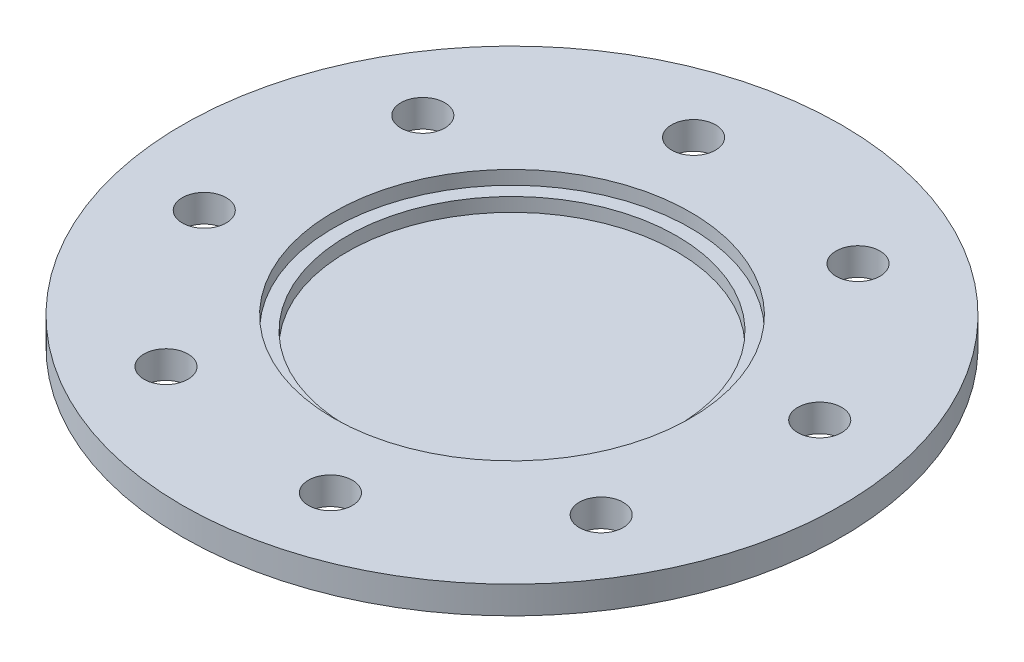
ISO-10303-21;
HEADER;
FILE_DESCRIPTION(('STEP AP214'),'2;1');
FILE_NAME('part.step','',(''),(''),'','','');
FILE_SCHEMA(('AUTOMOTIVE_DESIGN { 1 0 10303 214 1 1 1 1 }'));
ENDSEC;
DATA;
#1=APPLICATION_CONTEXT('core data for automotive mechanical design processes');
#2=APPLICATION_PROTOCOL_DEFINITION('international standard','automotive_design',2000,#1);
#3=PRODUCT_CONTEXT('',#1,'mechanical');
#4=PRODUCT('Part','Part','',(#3));
#5=PRODUCT_RELATED_PRODUCT_CATEGORY('part','',(#4));
#6=PRODUCT_DEFINITION_FORMATION('','',#4);
#7=PRODUCT_DEFINITION_CONTEXT('part definition',#1,'design');
#8=PRODUCT_DEFINITION('design','',#6,#7);
#9=PRODUCT_DEFINITION_SHAPE('','',#8);
#10=(LENGTH_UNIT() NAMED_UNIT(*) SI_UNIT(.MILLI.,.METRE.));
#11=(NAMED_UNIT(*) PLANE_ANGLE_UNIT() SI_UNIT($,.RADIAN.));
#12=(NAMED_UNIT(*) SI_UNIT($,.STERADIAN.) SOLID_ANGLE_UNIT());
#13=UNCERTAINTY_MEASURE_WITH_UNIT(LENGTH_MEASURE(1.E-05),#10,'distance_accuracy_value','');
#14=(GEOMETRIC_REPRESENTATION_CONTEXT(3) GLOBAL_UNCERTAINTY_ASSIGNED_CONTEXT((#13)) GLOBAL_UNIT_ASSIGNED_CONTEXT((#10,
#11,#12)) REPRESENTATION_CONTEXT('',''));
#15=CARTESIAN_POINT('',(0.,0.,0.));
#16=DIRECTION('',(0.,0.,1.));
#17=DIRECTION('',(1.,0.,0.));
#18=AXIS2_PLACEMENT_3D('',#15,#16,#17);
#19=CARTESIAN_POINT('',(0.,26.2861715894821,0.));
#20=DIRECTION('',(0.,1.,0.));
#21=DIRECTION('',(0.,0.,1.));
#22=AXIS2_PLACEMENT_3D('',#19,#20,#21);
#23=TOROIDAL_SURFACE('',#22,75.,5.);
#24=CARTESIAN_POINT('',(0.,26.2861715894821,0.));
#25=DIRECTION('',(0.,1.,0.));
#26=DIRECTION('',(0.,0.,1.));
#27=AXIS2_PLACEMENT_3D('',#24,#25,#26);
#28=CIRCLE('',#27,70.);
#29=CARTESIAN_POINT('',(0.,26.2861715894821,70.));
#30=VERTEX_POINT('',#29);
#31=EDGE_CURVE('E76',#30,#30,#28,.T.);
#32=ORIENTED_EDGE('',*,*,#31,.T.);
#33=EDGE_LOOP('',(#32));
#34=FACE_BOUND('',#33,.T.);
#35=CARTESIAN_POINT('',(0.,31.2861715894821,0.));
#36=DIRECTION('',(0.,1.,0.));
#37=DIRECTION('',(0.,0.,1.));
#38=AXIS2_PLACEMENT_3D('',#35,#36,#37);
#39=CIRCLE('',#38,75.);
#40=CARTESIAN_POINT('',(0.,31.2861715894821,75.));
#41=VERTEX_POINT('',#40);
#42=EDGE_CURVE('E10',#41,#41,#39,.T.);
#43=ORIENTED_EDGE('',*,*,#42,.F.);
#44=EDGE_LOOP('',(#43));
#45=FACE_BOUND('',#44,.T.);
#46=ADVANCED_FACE('F37',(#34,#45),#23,.F.);
#47=CARTESIAN_POINT('',(0.,31.2861715894821,0.));
#48=DIRECTION('',(0.,-1.,0.));
#49=DIRECTION('',(0.,0.,-1.));
#50=AXIS2_PLACEMENT_3D('',#47,#48,#49);
#51=PLANE('',#50);
#52=CARTESIAN_POINT('',(89.0872571350659,31.2861715894821,-22.9665107526295));
#53=DIRECTION('',(0.,-1.,0.));
#54=DIRECTION('',(-0.707106781186539,0.,-0.707106781186556));
#55=AXIS2_PLACEMENT_3D('',#52,#53,#54);
#56=CIRCLE('',#55,8.);
#57=CARTESIAN_POINT('',(83.4304028855736,31.2861715894821,-28.623365002122));
#58=VERTEX_POINT('',#57);
#59=EDGE_CURVE('E97',#58,#58,#56,.T.);
#60=ORIENTED_EDGE('',*,*,#59,.F.);
#61=EDGE_LOOP('',(#60));
#62=FACE_BOUND('',#61,.T.);
#63=CARTESIAN_POINT('',(46.7544281441365,31.2861715894821,-79.2339791308929));
#64=DIRECTION('',(0.,-1.,0.));
#65=DIRECTION('',(-1.,0.,0.));
#66=AXIS2_PLACEMENT_3D('',#63,#64,#65);
#67=CIRCLE('',#66,8.);
#68=CARTESIAN_POINT('',(38.7544281441365,31.2861715894821,-79.233979130893));
#69=VERTEX_POINT('',#68);
#70=EDGE_CURVE('E105',#69,#69,#67,.T.);
#71=ORIENTED_EDGE('',*,*,#70,.F.);
#72=EDGE_LOOP('',(#71));
#73=FACE_BOUND('',#72,.T.);
#74=CARTESIAN_POINT('',(-22.9665107526298,31.2861715894821,-89.0872571350658));
#75=DIRECTION('',(0.,-1.,0.));
#76=DIRECTION('',(-0.707106781186554,0.,0.707106781186541));
#77=AXIS2_PLACEMENT_3D('',#74,#75,#76);
#78=CIRCLE('',#77,8.);
#79=CARTESIAN_POINT('',(-28.6233650021223,31.2861715894821,-83.4304028855735));
#80=VERTEX_POINT('',#79);
#81=EDGE_CURVE('E113',#80,#80,#78,.T.);
#82=ORIENTED_EDGE('',*,*,#81,.F.);
#83=EDGE_LOOP('',(#82));
#84=FACE_BOUND('',#83,.T.);
#85=CARTESIAN_POINT('',(-79.2339791308934,31.2861715894821,-46.7544281441357));
#86=DIRECTION('',(0.,-1.,0.));
#87=DIRECTION('',(0.,0.,1.));
#88=AXIS2_PLACEMENT_3D('',#85,#86,#87);
#89=CIRCLE('',#88,8.);
#90=CARTESIAN_POINT('',(-79.2339791308934,31.2861715894821,-38.7544281441357));
#91=VERTEX_POINT('',#90);
#92=EDGE_CURVE('E121',#91,#91,#89,.T.);
#93=ORIENTED_EDGE('',*,*,#92,.F.);
#94=EDGE_LOOP('',(#93));
#95=FACE_BOUND('',#94,.T.);
#96=CARTESIAN_POINT('',(-89.0872571350657,31.2861715894821,22.9665107526301));
#97=DIRECTION('',(0.,-1.,0.));
#98=DIRECTION('',(0.707106781186544,0.,0.707106781186551));
#99=AXIS2_PLACEMENT_3D('',#96,#97,#98);
#100=CIRCLE('',#99,8.);
#101=CARTESIAN_POINT('',(-83.4304028855734,31.2861715894821,28.6233650021226));
#102=VERTEX_POINT('',#101);
#103=EDGE_CURVE('E129',#102,#102,#100,.T.);
#104=ORIENTED_EDGE('',*,*,#103,.F.);
#105=EDGE_LOOP('',(#104));
#106=FACE_BOUND('',#105,.T.);
#107=CARTESIAN_POINT('',(-46.754428144136,31.2861715894821,79.2339791308932));
#108=DIRECTION('',(0.,-1.,0.));
#109=DIRECTION('',(1.,0.,0.));
#110=AXIS2_PLACEMENT_3D('',#107,#108,#109);
#111=CIRCLE('',#110,8.);
#112=CARTESIAN_POINT('',(-38.754428144136,31.2861715894821,79.2339791308933));
#113=VERTEX_POINT('',#112);
#114=EDGE_CURVE('E137',#113,#113,#111,.T.);
#115=ORIENTED_EDGE('',*,*,#114,.F.);
#116=EDGE_LOOP('',(#115));
#117=FACE_BOUND('',#116,.T.);
#118=CARTESIAN_POINT('',(22.9665107526305,31.2861715894821,89.0872571350657));
#119=DIRECTION('',(0.,-1.,0.));
#120=DIRECTION('',(0.707106781186549,0.,-0.707106781186546));
#121=AXIS2_PLACEMENT_3D('',#118,#119,#120);
#122=CIRCLE('',#121,8.);
#123=CARTESIAN_POINT('',(28.6233650021229,31.2861715894821,83.4304028855733));
#124=VERTEX_POINT('',#123);
#125=EDGE_CURVE('E89',#124,#124,#122,.T.);
#126=ORIENTED_EDGE('',*,*,#125,.F.);
#127=EDGE_LOOP('',(#126));
#128=FACE_BOUND('',#127,.T.);
#129=CARTESIAN_POINT('',(79.2339791308934,31.2861715894821,46.7544281441357));
#130=DIRECTION('',(0.,-1.,0.));
#131=DIRECTION('',(0.,0.,-1.));
#132=AXIS2_PLACEMENT_3D('',#129,#130,#131);
#133=CIRCLE('',#132,8.);
#134=CARTESIAN_POINT('',(79.2339791308934,31.2861715894821,38.7544281441357));
#135=VERTEX_POINT('',#134);
#136=EDGE_CURVE('E81',#135,#135,#133,.T.);
#137=ORIENTED_EDGE('',*,*,#136,.F.);
#138=EDGE_LOOP('',(#137));
#139=FACE_BOUND('',#138,.T.);
#140=ORIENTED_EDGE('',*,*,#42,.T.);
#141=EDGE_LOOP('',(#140));
#142=FACE_BOUND('',#141,.T.);
#143=CARTESIAN_POINT('',(0.,31.2861715894821,0.));
#144=DIRECTION('',(0.,1.,0.));
#145=DIRECTION('',(0.,0.,1.));
#146=AXIS2_PLACEMENT_3D('',#143,#144,#145);
#147=CIRCLE('',#146,120.);
#148=CARTESIAN_POINT('',(0.,31.2861715894821,120.));
#149=VERTEX_POINT('',#148);
#150=EDGE_CURVE('E44',#149,#149,#147,.T.);
#151=ORIENTED_EDGE('',*,*,#150,.F.);
#152=EDGE_LOOP('',(#151));
#153=FACE_BOUND('',#152,.T.);
#154=ADVANCED_FACE('F156',(#62,#73,#84,#95,#106,#117,#128,#139,#142,#153),#51,.T.);
#155=CARTESIAN_POINT('',(0.,97.7316257619381,0.));
#156=DIRECTION('',(0.,1.,0.));
#157=DIRECTION('',(0.,0.,1.));
#158=AXIS2_PLACEMENT_3D('',#155,#156,#157);
#159=CYLINDRICAL_SURFACE('',#158,120.);
#160=ORIENTED_EDGE('',*,*,#150,.T.);
#161=EDGE_LOOP('',(#160));
#162=FACE_BOUND('',#161,.T.);
#163=CARTESIAN_POINT('',(0.,41.2861715894822,0.));
#164=DIRECTION('',(0.,1.,0.));
#165=DIRECTION('',(0.,0.,1.));
#166=AXIS2_PLACEMENT_3D('',#163,#164,#165);
#167=CIRCLE('',#166,120.);
#168=CARTESIAN_POINT('',(0.,41.2861715894822,120.));
#169=VERTEX_POINT('',#168);
#170=EDGE_CURVE('E49',#169,#169,#167,.T.);
#171=ORIENTED_EDGE('',*,*,#170,.F.);
#172=EDGE_LOOP('',(#171));
#173=FACE_BOUND('',#172,.T.);
#174=ADVANCED_FACE('F159',(#162,#173),#159,.T.);
#175=CARTESIAN_POINT('',(0.,41.2861715894822,0.));
#176=DIRECTION('',(0.,1.,0.));
#177=DIRECTION('',(0.,0.,1.));
#178=AXIS2_PLACEMENT_3D('',#175,#176,#177);
#179=PLANE('',#178);
#180=CARTESIAN_POINT('',(89.0872571350659,41.2861715894822,-22.9665107526295));
#181=DIRECTION('',(0.,-1.,0.));
#182=DIRECTION('',(-0.707106781186539,0.,-0.707106781186556));
#183=AXIS2_PLACEMENT_3D('',#180,#181,#182);
#184=CIRCLE('',#183,8.);
#185=CARTESIAN_POINT('',(83.4304028855736,41.2861715894822,-28.623365002122));
#186=VERTEX_POINT('',#185);
#187=EDGE_CURVE('E101',#186,#186,#184,.T.);
#188=ORIENTED_EDGE('',*,*,#187,.T.);
#189=EDGE_LOOP('',(#188));
#190=FACE_BOUND('',#189,.T.);
#191=CARTESIAN_POINT('',(46.7544281441365,41.2861715894822,-79.2339791308929));
#192=DIRECTION('',(0.,-1.,0.));
#193=DIRECTION('',(-1.,0.,0.));
#194=AXIS2_PLACEMENT_3D('',#191,#192,#193);
#195=CIRCLE('',#194,8.);
#196=CARTESIAN_POINT('',(38.7544281441365,41.2861715894822,-79.233979130893));
#197=VERTEX_POINT('',#196);
#198=EDGE_CURVE('E109',#197,#197,#195,.T.);
#199=ORIENTED_EDGE('',*,*,#198,.T.);
#200=EDGE_LOOP('',(#199));
#201=FACE_BOUND('',#200,.T.);
#202=CARTESIAN_POINT('',(-22.9665107526298,41.2861715894822,-89.0872571350658));
#203=DIRECTION('',(0.,-1.,0.));
#204=DIRECTION('',(-0.707106781186554,0.,0.707106781186541));
#205=AXIS2_PLACEMENT_3D('',#202,#203,#204);
#206=CIRCLE('',#205,8.);
#207=CARTESIAN_POINT('',(-28.6233650021223,41.2861715894822,-83.4304028855735));
#208=VERTEX_POINT('',#207);
#209=EDGE_CURVE('E117',#208,#208,#206,.T.);
#210=ORIENTED_EDGE('',*,*,#209,.T.);
#211=EDGE_LOOP('',(#210));
#212=FACE_BOUND('',#211,.T.);
#213=CARTESIAN_POINT('',(-79.2339791308934,41.2861715894822,-46.7544281441357));
#214=DIRECTION('',(0.,-1.,0.));
#215=DIRECTION('',(0.,0.,1.));
#216=AXIS2_PLACEMENT_3D('',#213,#214,#215);
#217=CIRCLE('',#216,8.);
#218=CARTESIAN_POINT('',(-79.2339791308934,41.2861715894822,-38.7544281441357));
#219=VERTEX_POINT('',#218);
#220=EDGE_CURVE('E125',#219,#219,#217,.T.);
#221=ORIENTED_EDGE('',*,*,#220,.T.);
#222=EDGE_LOOP('',(#221));
#223=FACE_BOUND('',#222,.T.);
#224=CARTESIAN_POINT('',(-89.0872571350657,41.2861715894822,22.9665107526301));
#225=DIRECTION('',(0.,-1.,0.));
#226=DIRECTION('',(0.707106781186544,0.,0.707106781186551));
#227=AXIS2_PLACEMENT_3D('',#224,#225,#226);
#228=CIRCLE('',#227,8.);
#229=CARTESIAN_POINT('',(-83.4304028855734,41.2861715894822,28.6233650021226));
#230=VERTEX_POINT('',#229);
#231=EDGE_CURVE('E133',#230,#230,#228,.T.);
#232=ORIENTED_EDGE('',*,*,#231,.T.);
#233=EDGE_LOOP('',(#232));
#234=FACE_BOUND('',#233,.T.);
#235=CARTESIAN_POINT('',(-46.754428144136,41.2861715894822,79.2339791308932));
#236=DIRECTION('',(0.,-1.,0.));
#237=DIRECTION('',(1.,0.,0.));
#238=AXIS2_PLACEMENT_3D('',#235,#236,#237);
#239=CIRCLE('',#238,8.);
#240=CARTESIAN_POINT('',(-38.754428144136,41.2861715894822,79.2339791308933));
#241=VERTEX_POINT('',#240);
#242=EDGE_CURVE('E93',#241,#241,#239,.T.);
#243=ORIENTED_EDGE('',*,*,#242,.T.);
#244=EDGE_LOOP('',(#243));
#245=FACE_BOUND('',#244,.T.);
#246=CARTESIAN_POINT('',(22.9665107526305,41.2861715894822,89.0872571350657));
#247=DIRECTION('',(0.,-1.,0.));
#248=DIRECTION('',(0.707106781186549,0.,-0.707106781186546));
#249=AXIS2_PLACEMENT_3D('',#246,#247,#248);
#250=CIRCLE('',#249,8.);
#251=CARTESIAN_POINT('',(28.6233650021229,41.2861715894822,83.4304028855733));
#252=VERTEX_POINT('',#251);
#253=EDGE_CURVE('E85',#252,#252,#250,.T.);
#254=ORIENTED_EDGE('',*,*,#253,.T.);
#255=EDGE_LOOP('',(#254));
#256=FACE_BOUND('',#255,.T.);
#257=CARTESIAN_POINT('',(79.2339791308934,41.2861715894822,46.7544281441357));
#258=DIRECTION('',(0.,-1.,0.));
#259=DIRECTION('',(0.,0.,-1.));
#260=AXIS2_PLACEMENT_3D('',#257,#258,#259);
#261=CIRCLE('',#260,8.);
#262=CARTESIAN_POINT('',(79.2339791308934,41.2861715894822,38.7544281441357));
#263=VERTEX_POINT('',#262);
#264=EDGE_CURVE('E80',#263,#263,#261,.T.);
#265=ORIENTED_EDGE('',*,*,#264,.T.);
#266=EDGE_LOOP('',(#265));
#267=FACE_BOUND('',#266,.T.);
#268=ORIENTED_EDGE('',*,*,#170,.T.);
#269=EDGE_LOOP('',(#268));
#270=FACE_BOUND('',#269,.T.);
#271=CARTESIAN_POINT('',(0.,41.2861715894822,0.));
#272=DIRECTION('',(0.,1.,0.));
#273=DIRECTION('',(0.,0.,1.));
#274=AXIS2_PLACEMENT_3D('',#271,#272,#273);
#275=CIRCLE('',#274,65.);
#276=CARTESIAN_POINT('',(0.,41.2861715894822,65.));
#277=VERTEX_POINT('',#276);
#278=EDGE_CURVE('E54',#277,#277,#275,.T.);
#279=ORIENTED_EDGE('',*,*,#278,.F.);
#280=EDGE_LOOP('',(#279));
#281=FACE_BOUND('',#280,.T.);
#282=ADVANCED_FACE('F145',(#190,#201,#212,#223,#234,#245,#256,#267,#270,#281),#179,.T.);
#283=CARTESIAN_POINT('',(0.,97.7316257619381,0.));
#284=DIRECTION('',(0.,1.,0.));
#285=DIRECTION('',(0.,0.,1.));
#286=AXIS2_PLACEMENT_3D('',#283,#284,#285);
#287=CYLINDRICAL_SURFACE('',#286,65.);
#288=CARTESIAN_POINT('',(0.,36.2861715894821,0.));
#289=DIRECTION('',(0.,1.,0.));
#290=DIRECTION('',(0.,0.,1.));
#291=AXIS2_PLACEMENT_3D('',#288,#289,#290);
#292=CIRCLE('',#291,65.);
#293=CARTESIAN_POINT('',(0.,36.2861715894821,65.));
#294=VERTEX_POINT('',#293);
#295=EDGE_CURVE('E60',#294,#294,#292,.T.);
#296=ORIENTED_EDGE('',*,*,#295,.F.);
#297=EDGE_LOOP('',(#296));
#298=FACE_BOUND('',#297,.T.);
#299=ORIENTED_EDGE('',*,*,#278,.T.);
#300=EDGE_LOOP('',(#299));
#301=FACE_BOUND('',#300,.T.);
#302=ADVANCED_FACE('F205',(#298,#301),#287,.F.);
#303=CARTESIAN_POINT('',(0.,36.2861715894821,0.));
#304=DIRECTION('',(0.,-1.,0.));
#305=DIRECTION('',(0.,0.,-1.));
#306=AXIS2_PLACEMENT_3D('',#303,#304,#305);
#307=PLANE('',#306);
#308=CARTESIAN_POINT('',(0.,36.2861715894821,0.));
#309=DIRECTION('',(0.,1.,0.));
#310=DIRECTION('',(0.,0.,1.));
#311=AXIS2_PLACEMENT_3D('',#308,#309,#310);
#312=CIRCLE('',#311,60.);
#313=CARTESIAN_POINT('',(0.,36.2861715894821,60.));
#314=VERTEX_POINT('',#313);
#315=EDGE_CURVE('E64',#314,#314,#312,.T.);
#316=ORIENTED_EDGE('',*,*,#315,.F.);
#317=EDGE_LOOP('',(#316));
#318=FACE_BOUND('',#317,.T.);
#319=ORIENTED_EDGE('',*,*,#295,.T.);
#320=EDGE_LOOP('',(#319));
#321=FACE_BOUND('',#320,.T.);
#322=ADVANCED_FACE('F213',(#318,#321),#307,.F.);
#323=CARTESIAN_POINT('',(0.,97.7316257619381,0.));
#324=DIRECTION('',(0.,1.,0.));
#325=DIRECTION('',(0.,0.,1.));
#326=AXIS2_PLACEMENT_3D('',#323,#324,#325);
#327=CYLINDRICAL_SURFACE('',#326,60.);
#328=CARTESIAN_POINT('',(0.,31.2861715894821,0.));
#329=DIRECTION('',(0.,1.,0.));
#330=DIRECTION('',(0.,0.,1.));
#331=AXIS2_PLACEMENT_3D('',#328,#329,#330);
#332=CIRCLE('',#331,60.);
#333=CARTESIAN_POINT('',(0.,31.2861715894821,60.));
#334=VERTEX_POINT('',#333);
#335=EDGE_CURVE('E68',#334,#334,#332,.T.);
#336=ORIENTED_EDGE('',*,*,#335,.F.);
#337=EDGE_LOOP('',(#336));
#338=FACE_BOUND('',#337,.T.);
#339=ORIENTED_EDGE('',*,*,#315,.T.);
#340=EDGE_LOOP('',(#339));
#341=FACE_BOUND('',#340,.T.);
#342=ADVANCED_FACE('F221',(#338,#341),#327,.F.);
#343=CARTESIAN_POINT('',(0.,31.2861715894821,0.));
#344=DIRECTION('',(0.,1.,0.));
#345=DIRECTION('',(0.,0.,1.));
#346=AXIS2_PLACEMENT_3D('',#343,#344,#345);
#347=PLANE('',#346);
#348=ORIENTED_EDGE('',*,*,#335,.T.);
#349=EDGE_LOOP('',(#348));
#350=FACE_BOUND('',#349,.T.);
#351=ADVANCED_FACE('F229',(#350),#347,.T.);
#352=CARTESIAN_POINT('',(0.,21.2861715894821,0.));
#353=DIRECTION('',(0.,-1.,0.));
#354=DIRECTION('',(0.,0.,-1.));
#355=AXIS2_PLACEMENT_3D('',#352,#353,#354);
#356=PLANE('',#355);
#357=CARTESIAN_POINT('',(0.,21.2861715894822,0.));
#358=DIRECTION('',(0.,1.,0.));
#359=DIRECTION('',(0.,0.,1.));
#360=AXIS2_PLACEMENT_3D('',#357,#358,#359);
#361=CIRCLE('',#360,70.);
#362=CARTESIAN_POINT('',(0.,21.2861715894822,70.));
#363=VERTEX_POINT('',#362);
#364=EDGE_CURVE('E72',#363,#363,#361,.T.);
#365=ORIENTED_EDGE('',*,*,#364,.F.);
#366=EDGE_LOOP('',(#365));
#367=FACE_BOUND('',#366,.T.);
#368=ADVANCED_FACE('F177',(#367),#356,.T.);
#369=CARTESIAN_POINT('',(0.,97.7316257619381,0.));
#370=DIRECTION('',(0.,1.,0.));
#371=DIRECTION('',(0.,0.,1.));
#372=AXIS2_PLACEMENT_3D('',#369,#370,#371);
#373=CYLINDRICAL_SURFACE('',#372,70.);
#374=ORIENTED_EDGE('',*,*,#364,.T.);
#375=EDGE_LOOP('',(#374));
#376=FACE_BOUND('',#375,.T.);
#377=ORIENTED_EDGE('',*,*,#31,.F.);
#378=EDGE_LOOP('',(#377));
#379=FACE_BOUND('',#378,.T.);
#380=ADVANCED_FACE('F168',(#376,#379),#373,.T.);
#381=CARTESIAN_POINT('',(79.2339791308934,41.2861715894822,46.7544281441357));
#382=DIRECTION('',(0.,-1.,0.));
#383=DIRECTION('',(0.,0.,-1.));
#384=AXIS2_PLACEMENT_3D('',#381,#382,#383);
#385=CYLINDRICAL_SURFACE('',#384,8.);
#386=ORIENTED_EDGE('',*,*,#264,.F.);
#387=EDGE_LOOP('',(#386));
#388=FACE_BOUND('',#387,.T.);
#389=ORIENTED_EDGE('',*,*,#136,.T.);
#390=EDGE_LOOP('',(#389));
#391=FACE_BOUND('',#390,.T.);
#392=ADVANCED_FACE('F166',(#388,#391),#385,.F.);
#393=CARTESIAN_POINT('',(22.9665107526305,41.2861715894822,89.0872571350657));
#394=DIRECTION('',(0.,-1.,0.));
#395=DIRECTION('',(0.,0.,-1.));
#396=AXIS2_PLACEMENT_3D('',#393,#394,#395);
#397=CYLINDRICAL_SURFACE('',#396,8.);
#398=ORIENTED_EDGE('',*,*,#253,.F.);
#399=EDGE_LOOP('',(#398));
#400=FACE_BOUND('',#399,.T.);
#401=ORIENTED_EDGE('',*,*,#125,.T.);
#402=EDGE_LOOP('',(#401));
#403=FACE_BOUND('',#402,.T.);
#404=ADVANCED_FACE('F152',(#400,#403),#397,.F.);
#405=CARTESIAN_POINT('',(-46.754428144136,41.2861715894822,79.2339791308932));
#406=DIRECTION('',(0.,-1.,0.));
#407=DIRECTION('',(0.,0.,-1.));
#408=AXIS2_PLACEMENT_3D('',#405,#406,#407);
#409=CYLINDRICAL_SURFACE('',#408,8.);
#410=ORIENTED_EDGE('',*,*,#242,.F.);
#411=EDGE_LOOP('',(#410));
#412=FACE_BOUND('',#411,.T.);
#413=ORIENTED_EDGE('',*,*,#114,.T.);
#414=EDGE_LOOP('',(#413));
#415=FACE_BOUND('',#414,.T.);
#416=ADVANCED_FACE('F148',(#412,#415),#409,.F.);
#417=CARTESIAN_POINT('',(-89.0872571350657,41.2861715894822,22.9665107526301));
#418=DIRECTION('',(0.,-1.,0.));
#419=DIRECTION('',(0.,0.,-1.));
#420=AXIS2_PLACEMENT_3D('',#417,#418,#419);
#421=CYLINDRICAL_SURFACE('',#420,8.);
#422=ORIENTED_EDGE('',*,*,#231,.F.);
#423=EDGE_LOOP('',(#422));
#424=FACE_BOUND('',#423,.T.);
#425=ORIENTED_EDGE('',*,*,#103,.T.);
#426=EDGE_LOOP('',(#425));
#427=FACE_BOUND('',#426,.T.);
#428=ADVANCED_FACE('F151',(#424,#427),#421,.F.);
#429=CARTESIAN_POINT('',(-79.2339791308934,41.2861715894822,-46.7544281441357));
#430=DIRECTION('',(0.,-1.,0.));
#431=DIRECTION('',(0.,0.,-1.));
#432=AXIS2_PLACEMENT_3D('',#429,#430,#431);
#433=CYLINDRICAL_SURFACE('',#432,8.);
#434=ORIENTED_EDGE('',*,*,#220,.F.);
#435=EDGE_LOOP('',(#434));
#436=FACE_BOUND('',#435,.T.);
#437=ORIENTED_EDGE('',*,*,#92,.T.);
#438=EDGE_LOOP('',(#437));
#439=FACE_BOUND('',#438,.T.);
#440=ADVANCED_FACE('F272',(#436,#439),#433,.F.);
#441=CARTESIAN_POINT('',(-22.9665107526298,41.2861715894822,-89.0872571350658));
#442=DIRECTION('',(0.,-1.,0.));
#443=DIRECTION('',(0.,0.,-1.));
#444=AXIS2_PLACEMENT_3D('',#441,#442,#443);
#445=CYLINDRICAL_SURFACE('',#444,8.);
#446=ORIENTED_EDGE('',*,*,#209,.F.);
#447=EDGE_LOOP('',(#446));
#448=FACE_BOUND('',#447,.T.);
#449=ORIENTED_EDGE('',*,*,#81,.T.);
#450=EDGE_LOOP('',(#449));
#451=FACE_BOUND('',#450,.T.);
#452=ADVANCED_FACE('F281',(#448,#451),#445,.F.);
#453=CARTESIAN_POINT('',(46.7544281441365,41.2861715894822,-79.2339791308929));
#454=DIRECTION('',(0.,-1.,0.));
#455=DIRECTION('',(0.,0.,-1.));
#456=AXIS2_PLACEMENT_3D('',#453,#454,#455);
#457=CYLINDRICAL_SURFACE('',#456,8.);
#458=ORIENTED_EDGE('',*,*,#198,.F.);
#459=EDGE_LOOP('',(#458));
#460=FACE_BOUND('',#459,.T.);
#461=ORIENTED_EDGE('',*,*,#70,.T.);
#462=EDGE_LOOP('',(#461));
#463=FACE_BOUND('',#462,.T.);
#464=ADVANCED_FACE('F290',(#460,#463),#457,.F.);
#465=CARTESIAN_POINT('',(89.0872571350659,41.2861715894822,-22.9665107526295));
#466=DIRECTION('',(0.,-1.,0.));
#467=DIRECTION('',(0.,0.,-1.));
#468=AXIS2_PLACEMENT_3D('',#465,#466,#467);
#469=CYLINDRICAL_SURFACE('',#468,8.);
#470=ORIENTED_EDGE('',*,*,#187,.F.);
#471=EDGE_LOOP('',(#470));
#472=FACE_BOUND('',#471,.T.);
#473=ORIENTED_EDGE('',*,*,#59,.T.);
#474=EDGE_LOOP('',(#473));
#475=FACE_BOUND('',#474,.T.);
#476=ADVANCED_FACE('F299',(#472,#475),#469,.F.);
#477=CLOSED_SHELL('',(#46,#154,#174,#282,#302,#322,#342,#351,#368,#380,#392,#404,#416,#428,#440,
#452,#464,#476));
#478=MANIFOLD_SOLID_BREP('B2',#477);
#479=ADVANCED_BREP_SHAPE_REPRESENTATION('',(#18,#478),#14);
#480=SHAPE_DEFINITION_REPRESENTATION(#9,#479);
ENDSEC;
END-ISO-10303-21;
